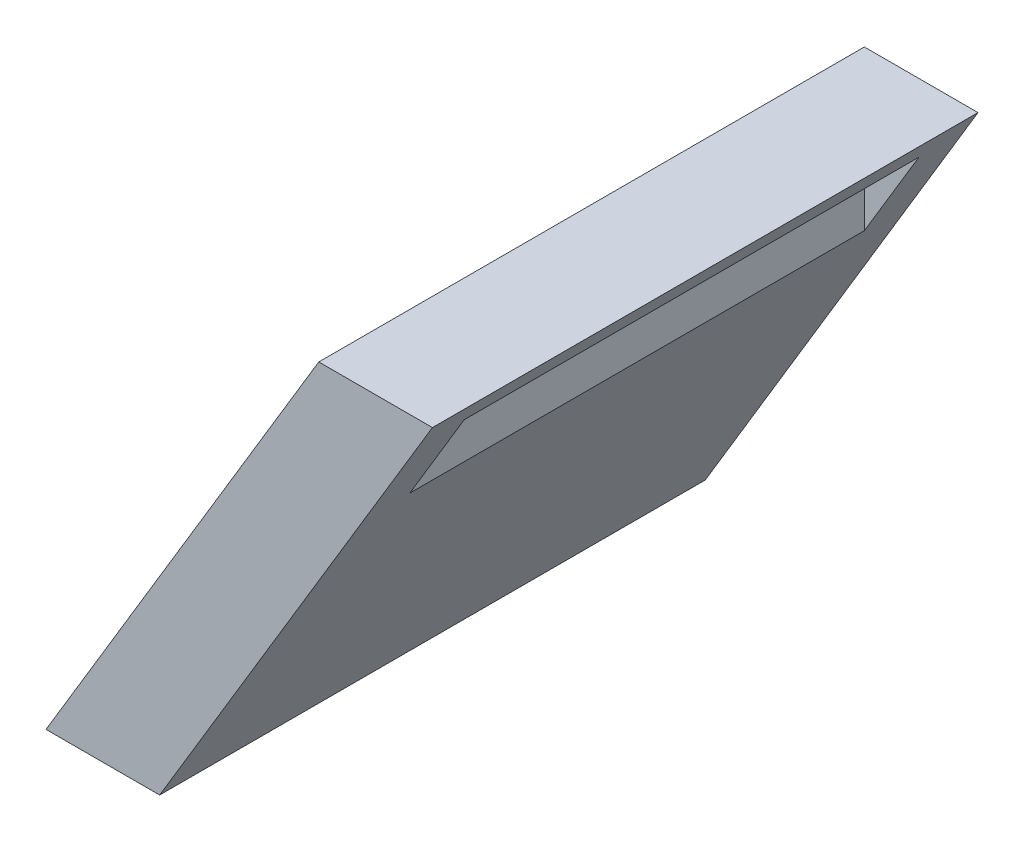
ISO-10303-21;
HEADER;
FILE_DESCRIPTION(('STEP AP214'),'2;1');
FILE_NAME('part.step','',(''),(''),'','','');
FILE_SCHEMA(('AUTOMOTIVE_DESIGN { 1 0 10303 214 1 1 1 1 }'));
ENDSEC;
DATA;
#1=APPLICATION_CONTEXT('core data for automotive mechanical design processes');
#2=APPLICATION_PROTOCOL_DEFINITION('international standard','automotive_design',2000,#1);
#3=PRODUCT_CONTEXT('',#1,'mechanical');
#4=PRODUCT('Part','Part','',(#3));
#5=PRODUCT_RELATED_PRODUCT_CATEGORY('part','',(#4));
#6=PRODUCT_DEFINITION_FORMATION('','',#4);
#7=PRODUCT_DEFINITION_CONTEXT('part definition',#1,'design');
#8=PRODUCT_DEFINITION('design','',#6,#7);
#9=PRODUCT_DEFINITION_SHAPE('','',#8);
#10=(LENGTH_UNIT() NAMED_UNIT(*) SI_UNIT(.MILLI.,.METRE.));
#11=(NAMED_UNIT(*) PLANE_ANGLE_UNIT() SI_UNIT($,.RADIAN.));
#12=(NAMED_UNIT(*) SI_UNIT($,.STERADIAN.) SOLID_ANGLE_UNIT());
#13=UNCERTAINTY_MEASURE_WITH_UNIT(LENGTH_MEASURE(1.E-05),#10,'distance_accuracy_value','');
#14=(GEOMETRIC_REPRESENTATION_CONTEXT(3) GLOBAL_UNCERTAINTY_ASSIGNED_CONTEXT((#13)) GLOBAL_UNIT_ASSIGNED_CONTEXT((#10,
#11,#12)) REPRESENTATION_CONTEXT('',''));
#15=CARTESIAN_POINT('',(0.,0.,0.));
#16=DIRECTION('',(0.,0.,1.));
#17=DIRECTION('',(1.,0.,0.));
#18=AXIS2_PLACEMENT_3D('',#15,#16,#17);
#19=CARTESIAN_POINT('',(-14.,0.,48.));
#20=DIRECTION('',(-0.857492925712544,0.514495755427527,0.));
#21=DIRECTION('',(-0.514495755427527,-0.857492925712544,0.));
#22=AXIS2_PLACEMENT_3D('',#19,#20,#21);
#23=PLANE('',#22);
#24=DIRECTION('',(0.514495755427526,0.857492925712544,0.));
#25=VECTOR('',#24,1.);
#26=CARTESIAN_POINT('',(-14.,0.,0.));
#27=LINE('',#26,#25);
#28=CARTESIAN_POINT('',(-14.,0.,0.));
#29=VERTEX_POINT('',#28);
#30=CARTESIAN_POINT('',(10.,40.,0.));
#31=VERTEX_POINT('',#30);
#32=EDGE_CURVE('E146',#29,#31,#27,.T.);
#33=ORIENTED_EDGE('',*,*,#32,.T.);
#34=DIRECTION('',(0.,0.,-1.));
#35=VECTOR('',#34,1.);
#36=CARTESIAN_POINT('',(10.,40.,48.));
#37=LINE('',#36,#35);
#38=CARTESIAN_POINT('',(10.,40.,48.));
#39=VERTEX_POINT('',#38);
#40=EDGE_CURVE('E173',#39,#31,#37,.T.);
#41=ORIENTED_EDGE('',*,*,#40,.F.);
#42=DIRECTION('',(0.514495755427526,0.857492925712544,0.));
#43=VECTOR('',#42,1.);
#44=CARTESIAN_POINT('',(-14.,0.,48.));
#45=LINE('',#44,#43);
#46=CARTESIAN_POINT('',(-14.,0.,48.));
#47=VERTEX_POINT('',#46);
#48=EDGE_CURVE('E147',#47,#39,#45,.T.);
#49=ORIENTED_EDGE('',*,*,#48,.F.);
#50=DIRECTION('',(0.,0.,-1.));
#51=VECTOR('',#50,1.);
#52=CARTESIAN_POINT('',(-14.,0.,48.));
#53=LINE('',#52,#51);
#54=EDGE_CURVE('E157',#47,#29,#53,.T.);
#55=ORIENTED_EDGE('',*,*,#54,.T.);
#56=EDGE_LOOP('',(#33,#41,#49,#55));
#57=FACE_BOUND('',#56,.T.);
#58=DIRECTION('',(0.514495755427527,0.857492925712544,0.));
#59=VECTOR('',#58,1.);
#60=CARTESIAN_POINT('',(-14.,0.,4.));
#61=LINE('',#60,#59);
#62=CARTESIAN_POINT('',(4.,30.,4.));
#63=VERTEX_POINT('',#62);
#64=CARTESIAN_POINT('',(8.8,38.,4.));
#65=VERTEX_POINT('',#64);
#66=EDGE_CURVE('E11',#63,#65,#61,.T.);
#67=ORIENTED_EDGE('',*,*,#66,.F.);
#68=DIRECTION('',(0.,0.,-1.));
#69=VECTOR('',#68,1.);
#70=CARTESIAN_POINT('',(3.99999999999999,30.,48.));
#71=LINE('',#70,#69);
#72=CARTESIAN_POINT('',(4.,30.,44.));
#73=VERTEX_POINT('',#72);
#74=EDGE_CURVE('E44',#73,#63,#71,.T.);
#75=ORIENTED_EDGE('',*,*,#74,.F.);
#76=DIRECTION('',(-0.514495755427527,-0.857492925712544,0.));
#77=VECTOR('',#76,1.);
#78=CARTESIAN_POINT('',(-14.,0.,44.));
#79=LINE('',#78,#77);
#80=CARTESIAN_POINT('',(8.8,38.,44.));
#81=VERTEX_POINT('',#80);
#82=EDGE_CURVE('E187',#81,#73,#79,.T.);
#83=ORIENTED_EDGE('',*,*,#82,.F.);
#84=DIRECTION('',(0.,0.,1.));
#85=VECTOR('',#84,1.);
#86=CARTESIAN_POINT('',(8.8,38.,48.));
#87=LINE('',#86,#85);
#88=EDGE_CURVE('E185',#65,#81,#87,.T.);
#89=ORIENTED_EDGE('',*,*,#88,.F.);
#90=EDGE_LOOP('',(#67,#75,#83,#89));
#91=FACE_BOUND('',#90,.T.);
#92=ADVANCED_FACE('F37',(#57,#91),#23,.F.);
#93=CARTESIAN_POINT('',(-24.,0.,48.));
#94=DIRECTION('',(0.857492925712544,-0.514495755427526,0.));
#95=DIRECTION('',(0.514495755427526,0.857492925712544,0.));
#96=AXIS2_PLACEMENT_3D('',#93,#94,#95);
#97=PLANE('',#96);
#98=DIRECTION('',(-0.514495755427526,-0.857492925712544,0.));
#99=VECTOR('',#98,1.);
#100=CARTESIAN_POINT('',(-24.,0.,0.));
#101=LINE('',#100,#99);
#102=CARTESIAN_POINT('',(0.,40.,0.));
#103=VERTEX_POINT('',#102);
#104=CARTESIAN_POINT('',(-24.,0.,0.));
#105=VERTEX_POINT('',#104);
#106=EDGE_CURVE('E162',#103,#105,#101,.T.);
#107=ORIENTED_EDGE('',*,*,#106,.T.);
#108=DIRECTION('',(0.,0.,-1.));
#109=VECTOR('',#108,1.);
#110=CARTESIAN_POINT('',(-24.,0.,48.));
#111=LINE('',#110,#109);
#112=CARTESIAN_POINT('',(-24.,0.,48.));
#113=VERTEX_POINT('',#112);
#114=EDGE_CURVE('E167',#113,#105,#111,.T.);
#115=ORIENTED_EDGE('',*,*,#114,.F.);
#116=DIRECTION('',(-0.514495755427526,-0.857492925712544,0.));
#117=VECTOR('',#116,1.);
#118=CARTESIAN_POINT('',(-24.,0.,48.));
#119=LINE('',#118,#117);
#120=CARTESIAN_POINT('',(0.,40.,48.));
#121=VERTEX_POINT('',#120);
#122=EDGE_CURVE('E153',#121,#113,#119,.T.);
#123=ORIENTED_EDGE('',*,*,#122,.F.);
#124=DIRECTION('',(0.,0.,-1.));
#125=VECTOR('',#124,1.);
#126=CARTESIAN_POINT('',(0.,40.,48.));
#127=LINE('',#126,#125);
#128=EDGE_CURVE('E170',#121,#103,#127,.T.);
#129=ORIENTED_EDGE('',*,*,#128,.T.);
#130=EDGE_LOOP('',(#107,#115,#123,#129));
#131=FACE_BOUND('',#130,.T.);
#132=DIRECTION('',(0.,0.,-1.));
#133=VECTOR('',#132,1.);
#134=CARTESIAN_POINT('',(-17.,11.6666666666667,48.));
#135=LINE('',#134,#133);
#136=CARTESIAN_POINT('',(-17.,11.6666666666666,44.));
#137=VERTEX_POINT('',#136);
#138=CARTESIAN_POINT('',(-17.,11.6666666666666,3.99999999999999));
#139=VERTEX_POINT('',#138);
#140=EDGE_CURVE('E183',#137,#139,#135,.T.);
#141=ORIENTED_EDGE('',*,*,#140,.F.);
#142=DIRECTION('',(0.514495755427526,0.857492925712544,0.));
#143=VECTOR('',#142,1.);
#144=CARTESIAN_POINT('',(-24.,0.,44.));
#145=LINE('',#144,#143);
#146=CARTESIAN_POINT('',(-22.8,2.,44.));
#147=VERTEX_POINT('',#146);
#148=EDGE_CURVE('E179',#147,#137,#145,.T.);
#149=ORIENTED_EDGE('',*,*,#148,.F.);
#150=DIRECTION('',(0.,0.,-1.));
#151=VECTOR('',#150,1.);
#152=CARTESIAN_POINT('',(-22.8,2.,48.));
#153=LINE('',#152,#151);
#154=CARTESIAN_POINT('',(-22.8,2.,3.99999999999999));
#155=VERTEX_POINT('',#154);
#156=EDGE_CURVE('E176',#147,#155,#153,.T.);
#157=ORIENTED_EDGE('',*,*,#156,.T.);
#158=DIRECTION('',(-0.514495755427526,-0.857492925712544,0.));
#159=VECTOR('',#158,1.);
#160=CARTESIAN_POINT('',(-24.,0.,3.99999999999999));
#161=LINE('',#160,#159);
#162=EDGE_CURVE('E181',#139,#155,#161,.T.);
#163=ORIENTED_EDGE('',*,*,#162,.F.);
#164=EDGE_LOOP('',(#141,#149,#157,#163));
#165=FACE_BOUND('',#164,.T.);
#166=ADVANCED_FACE('F193',(#131,#165),#97,.F.);
#167=CARTESIAN_POINT('',(0.,40.,48.));
#168=DIRECTION('',(0.,-1.,0.));
#169=DIRECTION('',(0.,0.,-1.));
#170=AXIS2_PLACEMENT_3D('',#167,#168,#169);
#171=PLANE('',#170);
#172=DIRECTION('',(-1.,0.,0.));
#173=VECTOR('',#172,1.);
#174=CARTESIAN_POINT('',(0.,40.,0.));
#175=LINE('',#174,#173);
#176=EDGE_CURVE('E160',#31,#103,#175,.T.);
#177=ORIENTED_EDGE('',*,*,#176,.T.);
#178=ORIENTED_EDGE('',*,*,#128,.F.);
#179=DIRECTION('',(-1.,0.,0.));
#180=VECTOR('',#179,1.);
#181=CARTESIAN_POINT('',(0.,40.,48.));
#182=LINE('',#181,#180);
#183=EDGE_CURVE('E150',#39,#121,#182,.T.);
#184=ORIENTED_EDGE('',*,*,#183,.F.);
#185=ORIENTED_EDGE('',*,*,#40,.T.);
#186=EDGE_LOOP('',(#177,#178,#184,#185));
#187=FACE_BOUND('',#186,.T.);
#188=ADVANCED_FACE('F198',(#187),#171,.F.);
#189=CARTESIAN_POINT('',(-24.,0.,48.));
#190=DIRECTION('',(0.,1.,0.));
#191=DIRECTION('',(0.,0.,1.));
#192=AXIS2_PLACEMENT_3D('',#189,#190,#191);
#193=PLANE('',#192);
#194=CARTESIAN_POINT('',(-20.4,0.,9.00000000000001));
#195=DIRECTION('',(0.,1.,0.));
#196=DIRECTION('',(0.,0.,1.));
#197=AXIS2_PLACEMENT_3D('',#194,#195,#196);
#198=CIRCLE('',#197,1.8);
#199=CARTESIAN_POINT('',(-20.4,0.,10.8));
#200=VERTEX_POINT('',#199);
#201=EDGE_CURVE('E118',#200,#200,#198,.T.);
#202=ORIENTED_EDGE('',*,*,#201,.T.);
#203=EDGE_LOOP('',(#202));
#204=FACE_BOUND('',#203,.T.);
#205=CARTESIAN_POINT('',(-20.4,0.,39.));
#206=DIRECTION('',(0.,1.,0.));
#207=DIRECTION('',(0.,0.,1.));
#208=AXIS2_PLACEMENT_3D('',#205,#206,#207);
#209=CIRCLE('',#208,1.8);
#210=CARTESIAN_POINT('',(-20.4,0.,40.8));
#211=VERTEX_POINT('',#210);
#212=EDGE_CURVE('E348',#211,#211,#209,.T.);
#213=ORIENTED_EDGE('',*,*,#212,.T.);
#214=EDGE_LOOP('',(#213));
#215=FACE_BOUND('',#214,.T.);
#216=DIRECTION('',(1.,0.,0.));
#217=VECTOR('',#216,1.);
#218=CARTESIAN_POINT('',(-24.,0.,0.));
#219=LINE('',#218,#217);
#220=EDGE_CURVE('E151',#105,#29,#219,.T.);
#221=ORIENTED_EDGE('',*,*,#220,.T.);
#222=ORIENTED_EDGE('',*,*,#54,.F.);
#223=DIRECTION('',(1.,0.,0.));
#224=VECTOR('',#223,1.);
#225=CARTESIAN_POINT('',(-24.,0.,48.));
#226=LINE('',#225,#224);
#227=EDGE_CURVE('E155',#113,#47,#226,.T.);
#228=ORIENTED_EDGE('',*,*,#227,.F.);
#229=ORIENTED_EDGE('',*,*,#114,.T.);
#230=EDGE_LOOP('',(#221,#222,#228,#229));
#231=FACE_BOUND('',#230,.T.);
#232=ADVANCED_FACE('F217',(#204,#215,#231),#193,.F.);
#233=CARTESIAN_POINT('',(0.,0.,48.));
#234=DIRECTION('',(0.,0.,-1.));
#235=DIRECTION('',(-1.,0.,0.));
#236=AXIS2_PLACEMENT_3D('',#233,#234,#235);
#237=PLANE('',#236);
#238=ORIENTED_EDGE('',*,*,#48,.T.);
#239=ORIENTED_EDGE('',*,*,#183,.T.);
#240=ORIENTED_EDGE('',*,*,#122,.T.);
#241=ORIENTED_EDGE('',*,*,#227,.T.);
#242=EDGE_LOOP('',(#238,#239,#240,#241));
#243=FACE_BOUND('',#242,.T.);
#244=ADVANCED_FACE('F213',(#243),#237,.F.);
#245=CARTESIAN_POINT('',(0.,0.,0.));
#246=DIRECTION('',(0.,0.,-1.));
#247=DIRECTION('',(-1.,0.,0.));
#248=AXIS2_PLACEMENT_3D('',#245,#246,#247);
#249=PLANE('',#248);
#250=ORIENTED_EDGE('',*,*,#32,.F.);
#251=ORIENTED_EDGE('',*,*,#220,.F.);
#252=ORIENTED_EDGE('',*,*,#106,.F.);
#253=ORIENTED_EDGE('',*,*,#176,.F.);
#254=EDGE_LOOP('',(#250,#251,#252,#253));
#255=FACE_BOUND('',#254,.T.);
#256=ADVANCED_FACE('F207',(#255),#249,.T.);
#257=CARTESIAN_POINT('',(-17.,50.,44.));
#258=DIRECTION('',(-1.,0.,0.));
#259=DIRECTION('',(0.,0.,1.));
#260=AXIS2_PLACEMENT_3D('',#257,#258,#259);
#261=PLANE('',#260);
#262=ORIENTED_EDGE('',*,*,#140,.T.);
#263=DIRECTION('',(0.,-1.,0.));
#264=VECTOR('',#263,1.);
#265=CARTESIAN_POINT('',(-17.,50.,3.99999999999999));
#266=LINE('',#265,#264);
#267=CARTESIAN_POINT('',(-17.,2.,3.99999999999999));
#268=VERTEX_POINT('',#267);
#269=EDGE_CURVE('E144',#139,#268,#266,.T.);
#270=ORIENTED_EDGE('',*,*,#269,.T.);
#271=DIRECTION('',(0.,0.,-1.));
#272=VECTOR('',#271,1.);
#273=CARTESIAN_POINT('',(-17.,2.,44.));
#274=LINE('',#273,#272);
#275=CARTESIAN_POINT('',(-17.,2.,44.));
#276=VERTEX_POINT('',#275);
#277=EDGE_CURVE('E125',#276,#268,#274,.T.);
#278=ORIENTED_EDGE('',*,*,#277,.F.);
#279=DIRECTION('',(0.,-1.,0.));
#280=VECTOR('',#279,1.);
#281=CARTESIAN_POINT('',(-17.,50.,44.));
#282=LINE('',#281,#280);
#283=EDGE_CURVE('E142',#137,#276,#282,.T.);
#284=ORIENTED_EDGE('',*,*,#283,.F.);
#285=EDGE_LOOP('',(#262,#270,#278,#284));
#286=FACE_BOUND('',#285,.T.);
#287=ADVANCED_FACE('F225',(#286),#261,.T.);
#288=CARTESIAN_POINT('',(-31.,50.,3.99999999999999));
#289=DIRECTION('',(0.,0.,1.));
#290=DIRECTION('',(1.,0.,0.));
#291=AXIS2_PLACEMENT_3D('',#288,#289,#290);
#292=PLANE('',#291);
#293=ORIENTED_EDGE('',*,*,#162,.T.);
#294=DIRECTION('',(-1.,0.,0.));
#295=VECTOR('',#294,1.);
#296=CARTESIAN_POINT('',(-31.,2.,3.99999999999999));
#297=LINE('',#296,#295);
#298=EDGE_CURVE('E58',#268,#155,#297,.T.);
#299=ORIENTED_EDGE('',*,*,#298,.F.);
#300=ORIENTED_EDGE('',*,*,#269,.F.);
#301=EDGE_LOOP('',(#293,#299,#300));
#302=FACE_BOUND('',#301,.T.);
#303=ADVANCED_FACE('F228',(#302),#292,.T.);
#304=CARTESIAN_POINT('',(-31.,50.,44.));
#305=DIRECTION('',(0.,0.,-1.));
#306=DIRECTION('',(-1.,0.,0.));
#307=AXIS2_PLACEMENT_3D('',#304,#305,#306);
#308=PLANE('',#307);
#309=ORIENTED_EDGE('',*,*,#148,.T.);
#310=ORIENTED_EDGE('',*,*,#283,.T.);
#311=DIRECTION('',(1.,0.,0.));
#312=VECTOR('',#311,1.);
#313=CARTESIAN_POINT('',(-31.,2.,44.));
#314=LINE('',#313,#312);
#315=EDGE_CURVE('E139',#147,#276,#314,.T.);
#316=ORIENTED_EDGE('',*,*,#315,.F.);
#317=EDGE_LOOP('',(#309,#310,#316));
#318=FACE_BOUND('',#317,.T.);
#319=ADVANCED_FACE('F232',(#318),#308,.T.);
#320=CARTESIAN_POINT('',(0.,2.,0.));
#321=DIRECTION('',(0.,-1.,0.));
#322=DIRECTION('',(0.,0.,-1.));
#323=AXIS2_PLACEMENT_3D('',#320,#321,#322);
#324=PLANE('',#323);
#325=CARTESIAN_POINT('',(-20.4,2.,9.00000000000001));
#326=DIRECTION('',(0.,1.,0.));
#327=DIRECTION('',(0.,0.,1.));
#328=AXIS2_PLACEMENT_3D('',#325,#326,#327);
#329=CIRCLE('',#328,1.8);
#330=CARTESIAN_POINT('',(-20.4,2.,10.8));
#331=VERTEX_POINT('',#330);
#332=EDGE_CURVE('E345',#331,#331,#329,.T.);
#333=ORIENTED_EDGE('',*,*,#332,.F.);
#334=EDGE_LOOP('',(#333));
#335=FACE_BOUND('',#334,.T.);
#336=CARTESIAN_POINT('',(-20.4,2.,39.));
#337=DIRECTION('',(0.,1.,0.));
#338=DIRECTION('',(0.,0.,-1.));
#339=AXIS2_PLACEMENT_3D('',#336,#337,#338);
#340=CIRCLE('',#339,1.8);
#341=CARTESIAN_POINT('',(-20.4,2.,37.2));
#342=VERTEX_POINT('',#341);
#343=EDGE_CURVE('E352',#342,#342,#340,.T.);
#344=ORIENTED_EDGE('',*,*,#343,.F.);
#345=EDGE_LOOP('',(#344));
#346=FACE_BOUND('',#345,.T.);
#347=ORIENTED_EDGE('',*,*,#315,.T.);
#348=ORIENTED_EDGE('',*,*,#277,.T.);
#349=ORIENTED_EDGE('',*,*,#298,.T.);
#350=ORIENTED_EDGE('',*,*,#156,.F.);
#351=EDGE_LOOP('',(#347,#348,#349,#350));
#352=FACE_BOUND('',#351,.T.);
#353=ADVANCED_FACE('F229',(#335,#346,#352),#324,.F.);
#354=CARTESIAN_POINT('',(4.,38.,4.));
#355=DIRECTION('',(0.,0.,1.));
#356=DIRECTION('',(1.,0.,0.));
#357=AXIS2_PLACEMENT_3D('',#354,#355,#356);
#358=PLANE('',#357);
#359=ORIENTED_EDGE('',*,*,#66,.T.);
#360=DIRECTION('',(-1.,0.,0.));
#361=VECTOR('',#360,1.);
#362=CARTESIAN_POINT('',(4.,38.,4.));
#363=LINE('',#362,#361);
#364=CARTESIAN_POINT('',(4.,38.,4.));
#365=VERTEX_POINT('',#364);
#366=EDGE_CURVE('E51',#65,#365,#363,.T.);
#367=ORIENTED_EDGE('',*,*,#366,.T.);
#368=DIRECTION('',(0.,-1.,0.));
#369=VECTOR('',#368,1.);
#370=CARTESIAN_POINT('',(4.,38.,4.));
#371=LINE('',#370,#369);
#372=EDGE_CURVE('E114',#365,#63,#371,.T.);
#373=ORIENTED_EDGE('',*,*,#372,.T.);
#374=EDGE_LOOP('',(#359,#367,#373));
#375=FACE_BOUND('',#374,.T.);
#376=ADVANCED_FACE('F113',(#375),#358,.T.);
#377=CARTESIAN_POINT('',(4.,38.,44.));
#378=DIRECTION('',(1.,0.,0.));
#379=DIRECTION('',(0.,0.,-1.));
#380=AXIS2_PLACEMENT_3D('',#377,#378,#379);
#381=PLANE('',#380);
#382=ORIENTED_EDGE('',*,*,#74,.T.);
#383=ORIENTED_EDGE('',*,*,#372,.F.);
#384=DIRECTION('',(0.,0.,1.));
#385=VECTOR('',#384,1.);
#386=CARTESIAN_POINT('',(4.,38.,44.));
#387=LINE('',#386,#385);
#388=CARTESIAN_POINT('',(4.,38.,44.));
#389=VERTEX_POINT('',#388);
#390=EDGE_CURVE('E117',#365,#389,#387,.T.);
#391=ORIENTED_EDGE('',*,*,#390,.T.);
#392=DIRECTION('',(0.,-1.,0.));
#393=VECTOR('',#392,1.);
#394=CARTESIAN_POINT('',(4.,38.,44.));
#395=LINE('',#394,#393);
#396=EDGE_CURVE('E126',#389,#73,#395,.T.);
#397=ORIENTED_EDGE('',*,*,#396,.T.);
#398=EDGE_LOOP('',(#382,#383,#391,#397));
#399=FACE_BOUND('',#398,.T.);
#400=ADVANCED_FACE('F121',(#399),#381,.T.);
#401=CARTESIAN_POINT('',(4.,38.,44.));
#402=DIRECTION('',(0.,0.,-1.));
#403=DIRECTION('',(-1.,0.,0.));
#404=AXIS2_PLACEMENT_3D('',#401,#402,#403);
#405=PLANE('',#404);
#406=ORIENTED_EDGE('',*,*,#82,.T.);
#407=ORIENTED_EDGE('',*,*,#396,.F.);
#408=DIRECTION('',(1.,0.,0.));
#409=VECTOR('',#408,1.);
#410=CARTESIAN_POINT('',(4.,38.,44.));
#411=LINE('',#410,#409);
#412=EDGE_CURVE('E131',#389,#81,#411,.T.);
#413=ORIENTED_EDGE('',*,*,#412,.T.);
#414=EDGE_LOOP('',(#406,#407,#413));
#415=FACE_BOUND('',#414,.T.);
#416=ADVANCED_FACE('F190',(#415),#405,.T.);
#417=CARTESIAN_POINT('',(0.,38.,0.));
#418=DIRECTION('',(0.,-1.,0.));
#419=DIRECTION('',(0.,0.,-1.));
#420=AXIS2_PLACEMENT_3D('',#417,#418,#419);
#421=PLANE('',#420);
#422=ORIENTED_EDGE('',*,*,#88,.T.);
#423=ORIENTED_EDGE('',*,*,#412,.F.);
#424=ORIENTED_EDGE('',*,*,#390,.F.);
#425=ORIENTED_EDGE('',*,*,#366,.F.);
#426=EDGE_LOOP('',(#422,#423,#424,#425));
#427=FACE_BOUND('',#426,.T.);
#428=ADVANCED_FACE('F129',(#427),#421,.T.);
#429=CARTESIAN_POINT('',(-20.4,-36.,39.));
#430=DIRECTION('',(0.,1.,0.));
#431=DIRECTION('',(0.,0.,1.));
#432=AXIS2_PLACEMENT_3D('',#429,#430,#431);
#433=CYLINDRICAL_SURFACE('',#432,1.8);
#434=ORIENTED_EDGE('',*,*,#343,.T.);
#435=EDGE_LOOP('',(#434));
#436=FACE_BOUND('',#435,.T.);
#437=ORIENTED_EDGE('',*,*,#212,.F.);
#438=EDGE_LOOP('',(#437));
#439=FACE_BOUND('',#438,.T.);
#440=ADVANCED_FACE('F318',(#436,#439),#433,.F.);
#441=CARTESIAN_POINT('',(-20.4,-36.,9.00000000000001));
#442=DIRECTION('',(0.,1.,0.));
#443=DIRECTION('',(0.,0.,1.));
#444=AXIS2_PLACEMENT_3D('',#441,#442,#443);
#445=CYLINDRICAL_SURFACE('',#444,1.8);
#446=ORIENTED_EDGE('',*,*,#332,.T.);
#447=EDGE_LOOP('',(#446));
#448=FACE_BOUND('',#447,.T.);
#449=ORIENTED_EDGE('',*,*,#201,.F.);
#450=EDGE_LOOP('',(#449));
#451=FACE_BOUND('',#450,.T.);
#452=ADVANCED_FACE('F328',(#448,#451),#445,.F.);
#453=CLOSED_SHELL('',(#92,#166,#188,#232,#244,#256,#287,#303,#319,#353,#376,#400,#416,#428,#440,#452));
#454=MANIFOLD_SOLID_BREP('B2',#453);
#455=ADVANCED_BREP_SHAPE_REPRESENTATION('',(#18,#454),#14);
#456=SHAPE_DEFINITION_REPRESENTATION(#9,#455);
ENDSEC;
END-ISO-10303-21;
